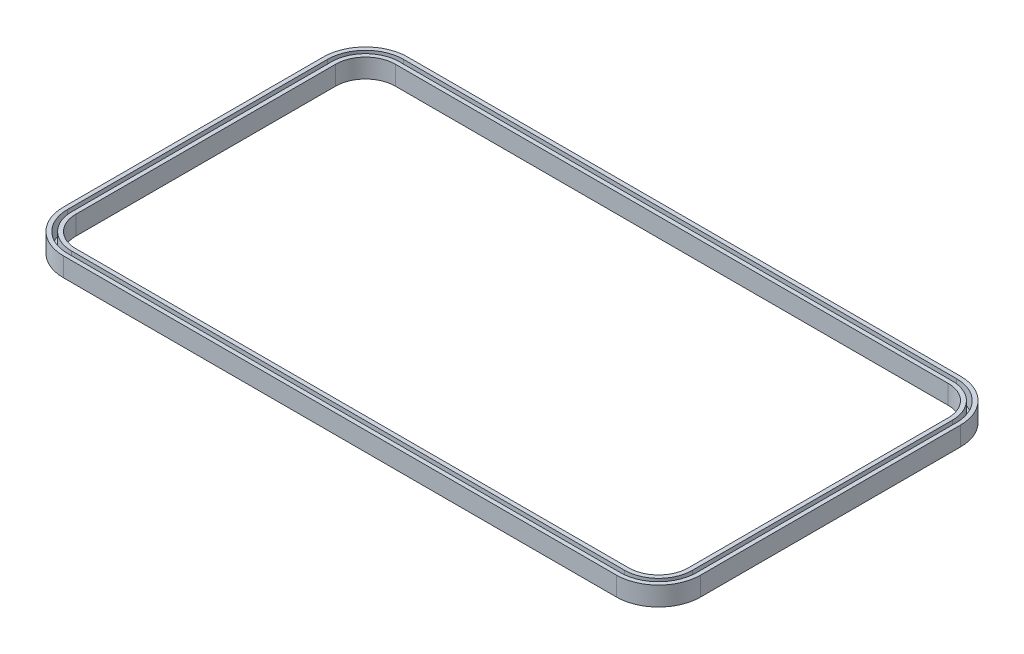
ISO-10303-21;
HEADER;
FILE_DESCRIPTION(('STEP AP214'),'2;1');
FILE_NAME('part.step','',(''),(''),'','','');
FILE_SCHEMA(('AUTOMOTIVE_DESIGN { 1 0 10303 214 1 1 1 1 }'));
ENDSEC;
DATA;
#1=APPLICATION_CONTEXT('core data for automotive mechanical design processes');
#2=APPLICATION_PROTOCOL_DEFINITION('international standard','automotive_design',2000,#1);
#3=PRODUCT_CONTEXT('',#1,'mechanical');
#4=PRODUCT('Part','Part','',(#3));
#5=PRODUCT_RELATED_PRODUCT_CATEGORY('part','',(#4));
#6=PRODUCT_DEFINITION_FORMATION('','',#4);
#7=PRODUCT_DEFINITION_CONTEXT('part definition',#1,'design');
#8=PRODUCT_DEFINITION('design','',#6,#7);
#9=PRODUCT_DEFINITION_SHAPE('','',#8);
#10=(LENGTH_UNIT() NAMED_UNIT(*) SI_UNIT(.MILLI.,.METRE.));
#11=(NAMED_UNIT(*) PLANE_ANGLE_UNIT() SI_UNIT($,.RADIAN.));
#12=(NAMED_UNIT(*) SI_UNIT($,.STERADIAN.) SOLID_ANGLE_UNIT());
#13=UNCERTAINTY_MEASURE_WITH_UNIT(LENGTH_MEASURE(1.E-05),#10,'distance_accuracy_value','');
#14=(GEOMETRIC_REPRESENTATION_CONTEXT(3) GLOBAL_UNCERTAINTY_ASSIGNED_CONTEXT((#13)) GLOBAL_UNIT_ASSIGNED_CONTEXT((#10,
#11,#12)) REPRESENTATION_CONTEXT('',''));
#15=CARTESIAN_POINT('',(0.,0.,0.));
#16=DIRECTION('',(0.,0.,1.));
#17=DIRECTION('',(1.,0.,0.));
#18=AXIS2_PLACEMENT_3D('',#15,#16,#17);
#19=CARTESIAN_POINT('',(167.,11.5,-78.5));
#20=DIRECTION('',(0.,-1.,0.));
#21=DIRECTION('',(0.,0.,-1.));
#22=AXIS2_PLACEMENT_3D('',#19,#20,#21);
#23=PLANE('',#22);
#24=DIRECTION('',(-1.,0.,0.));
#25=VECTOR('',#24,1.);
#26=CARTESIAN_POINT('',(-167.,11.5,-96.5));
#27=LINE('',#26,#25);
#28=CARTESIAN_POINT('',(167.,11.5,-96.5));
#29=VERTEX_POINT('',#28);
#30=CARTESIAN_POINT('',(-167.,11.5,-96.5));
#31=VERTEX_POINT('',#30);
#32=EDGE_CURVE('E481',#29,#31,#27,.T.);
#33=ORIENTED_EDGE('',*,*,#32,.F.);
#34=CARTESIAN_POINT('',(167.,11.5,-78.5));
#35=DIRECTION('',(0.,1.,0.));
#36=DIRECTION('',(0.,0.,1.));
#37=AXIS2_PLACEMENT_3D('',#34,#35,#36);
#38=CIRCLE('',#37,18.);
#39=CARTESIAN_POINT('',(185.,11.5,-78.4999999999999));
#40=VERTEX_POINT('',#39);
#41=EDGE_CURVE('E47',#40,#29,#38,.T.);
#42=ORIENTED_EDGE('',*,*,#41,.F.);
#43=DIRECTION('',(0.,0.,-1.));
#44=VECTOR('',#43,1.);
#45=CARTESIAN_POINT('',(185.,11.5,-78.4999999999999));
#46=LINE('',#45,#44);
#47=CARTESIAN_POINT('',(185.,11.5,78.4999999999999));
#48=VERTEX_POINT('',#47);
#49=EDGE_CURVE('E596',#48,#40,#46,.T.);
#50=ORIENTED_EDGE('',*,*,#49,.F.);
#51=CARTESIAN_POINT('',(167.,11.5,78.5));
#52=DIRECTION('',(0.,1.,0.));
#53=DIRECTION('',(0.,0.,1.));
#54=AXIS2_PLACEMENT_3D('',#51,#52,#53);
#55=CIRCLE('',#54,18.);
#56=CARTESIAN_POINT('',(167.,11.5,96.5));
#57=VERTEX_POINT('',#56);
#58=EDGE_CURVE('E594',#57,#48,#55,.T.);
#59=ORIENTED_EDGE('',*,*,#58,.F.);
#60=DIRECTION('',(1.,0.,0.));
#61=VECTOR('',#60,1.);
#62=CARTESIAN_POINT('',(-167.,11.5,96.5));
#63=LINE('',#62,#61);
#64=CARTESIAN_POINT('',(-167.,11.5,96.5));
#65=VERTEX_POINT('',#64);
#66=EDGE_CURVE('E591',#65,#57,#63,.T.);
#67=ORIENTED_EDGE('',*,*,#66,.F.);
#68=CARTESIAN_POINT('',(-167.,11.5,78.5));
#69=DIRECTION('',(0.,1.,0.));
#70=DIRECTION('',(0.,0.,1.));
#71=AXIS2_PLACEMENT_3D('',#68,#69,#70);
#72=CIRCLE('',#71,18.);
#73=CARTESIAN_POINT('',(-185.,11.5,78.4999999999999));
#74=VERTEX_POINT('',#73);
#75=EDGE_CURVE('E588',#74,#65,#72,.T.);
#76=ORIENTED_EDGE('',*,*,#75,.F.);
#77=DIRECTION('',(0.,0.,1.));
#78=VECTOR('',#77,1.);
#79=CARTESIAN_POINT('',(-185.,11.5,-78.4999999999999));
#80=LINE('',#79,#78);
#81=CARTESIAN_POINT('',(-185.,11.5,-78.5));
#82=VERTEX_POINT('',#81);
#83=EDGE_CURVE('E585',#82,#74,#80,.T.);
#84=ORIENTED_EDGE('',*,*,#83,.F.);
#85=CARTESIAN_POINT('',(-167.,11.5,-78.5));
#86=DIRECTION('',(0.,1.,0.));
#87=DIRECTION('',(0.,0.,1.));
#88=AXIS2_PLACEMENT_3D('',#85,#86,#87);
#89=CIRCLE('',#88,18.);
#90=EDGE_CURVE('E582',#31,#82,#89,.T.);
#91=ORIENTED_EDGE('',*,*,#90,.F.);
#92=EDGE_LOOP('',(#33,#42,#50,#59,#67,#76,#84,#91));
#93=FACE_BOUND('',#92,.T.);
#94=CARTESIAN_POINT('',(-167.,11.5,-78.5));
#95=DIRECTION('',(0.,1.,0.));
#96=DIRECTION('',(0.,0.,1.));
#97=AXIS2_PLACEMENT_3D('',#94,#95,#96);
#98=CIRCLE('',#97,20.5);
#99=CARTESIAN_POINT('',(-167.,11.5,-99.));
#100=VERTEX_POINT('',#99);
#101=CARTESIAN_POINT('',(-187.5,11.5,-78.4999999999999));
#102=VERTEX_POINT('',#101);
#103=EDGE_CURVE('E312',#100,#102,#98,.T.);
#104=ORIENTED_EDGE('',*,*,#103,.T.);
#105=DIRECTION('',(0.,0.,1.));
#106=VECTOR('',#105,1.);
#107=CARTESIAN_POINT('',(-187.5,11.5,-78.4999999999999));
#108=LINE('',#107,#106);
#109=CARTESIAN_POINT('',(-187.5,11.5,78.4999999999998));
#110=VERTEX_POINT('',#109);
#111=EDGE_CURVE('E261',#102,#110,#108,.T.);
#112=ORIENTED_EDGE('',*,*,#111,.T.);
#113=CARTESIAN_POINT('',(-167.,11.5,78.5));
#114=DIRECTION('',(0.,1.,0.));
#115=DIRECTION('',(0.,0.,1.));
#116=AXIS2_PLACEMENT_3D('',#113,#114,#115);
#117=CIRCLE('',#116,20.5);
#118=CARTESIAN_POINT('',(-167.,11.5,99.));
#119=VERTEX_POINT('',#118);
#120=EDGE_CURVE('E69',#110,#119,#117,.T.);
#121=ORIENTED_EDGE('',*,*,#120,.T.);
#122=DIRECTION('',(1.,0.,0.));
#123=VECTOR('',#122,1.);
#124=CARTESIAN_POINT('',(-167.,11.5,99.));
#125=LINE('',#124,#123);
#126=CARTESIAN_POINT('',(167.,11.5,99.));
#127=VERTEX_POINT('',#126);
#128=EDGE_CURVE('E319',#119,#127,#125,.T.);
#129=ORIENTED_EDGE('',*,*,#128,.T.);
#130=CARTESIAN_POINT('',(167.,11.5,78.5));
#131=DIRECTION('',(0.,1.,0.));
#132=DIRECTION('',(0.,0.,1.));
#133=AXIS2_PLACEMENT_3D('',#130,#131,#132);
#134=CIRCLE('',#133,20.5);
#135=CARTESIAN_POINT('',(187.5,11.5,78.4999999999998));
#136=VERTEX_POINT('',#135);
#137=EDGE_CURVE('E323',#127,#136,#134,.T.);
#138=ORIENTED_EDGE('',*,*,#137,.T.);
#139=DIRECTION('',(0.,0.,-1.));
#140=VECTOR('',#139,1.);
#141=CARTESIAN_POINT('',(187.5,11.5,-78.4999999999999));
#142=LINE('',#141,#140);
#143=CARTESIAN_POINT('',(187.5,11.5,-78.4999999999999));
#144=VERTEX_POINT('',#143);
#145=EDGE_CURVE('E327',#136,#144,#142,.T.);
#146=ORIENTED_EDGE('',*,*,#145,.T.);
#147=CARTESIAN_POINT('',(167.,11.5,-78.5));
#148=DIRECTION('',(0.,1.,0.));
#149=DIRECTION('',(0.,0.,-1.));
#150=AXIS2_PLACEMENT_3D('',#147,#148,#149);
#151=CIRCLE('',#150,20.5);
#152=CARTESIAN_POINT('',(167.,11.5,-99.));
#153=VERTEX_POINT('',#152);
#154=EDGE_CURVE('E289',#144,#153,#151,.T.);
#155=ORIENTED_EDGE('',*,*,#154,.T.);
#156=DIRECTION('',(-1.,0.,0.));
#157=VECTOR('',#156,1.);
#158=CARTESIAN_POINT('',(-167.,11.5,-99.));
#159=LINE('',#158,#157);
#160=EDGE_CURVE('E285',#153,#100,#159,.T.);
#161=ORIENTED_EDGE('',*,*,#160,.T.);
#162=EDGE_LOOP('',(#104,#112,#121,#129,#138,#146,#155,#161));
#163=FACE_BOUND('',#162,.T.);
#164=ADVANCED_FACE('F43',(#93,#163),#23,.F.);
#165=CARTESIAN_POINT('',(167.,11.5,-78.5));
#166=DIRECTION('',(0.,-1.,0.));
#167=DIRECTION('',(0.,0.,-1.));
#168=AXIS2_PLACEMENT_3D('',#165,#166,#167);
#169=CYLINDRICAL_SURFACE('',#168,25.5);
#170=CARTESIAN_POINT('',(167.,0.,-78.5));
#171=DIRECTION('',(0.,1.,0.));
#172=DIRECTION('',(0.,0.,-1.));
#173=AXIS2_PLACEMENT_3D('',#170,#171,#172);
#174=CIRCLE('',#173,25.5);
#175=CARTESIAN_POINT('',(192.5,0.,-78.4999999999998));
#176=VERTEX_POINT('',#175);
#177=CARTESIAN_POINT('',(167.,0.,-104.));
#178=VERTEX_POINT('',#177);
#179=EDGE_CURVE('E530',#176,#178,#174,.T.);
#180=ORIENTED_EDGE('',*,*,#179,.T.);
#181=DIRECTION('',(0.,-1.,0.));
#182=VECTOR('',#181,1.);
#183=CARTESIAN_POINT('',(167.,11.5,-104.));
#184=LINE('',#183,#182);
#185=CARTESIAN_POINT('',(167.,11.5,-104.));
#186=VERTEX_POINT('',#185);
#187=EDGE_CURVE('E11',#186,#178,#184,.T.);
#188=ORIENTED_EDGE('',*,*,#187,.F.);
#189=CARTESIAN_POINT('',(167.,11.5,-78.5));
#190=DIRECTION('',(0.,1.,0.));
#191=DIRECTION('',(0.,0.,-1.));
#192=AXIS2_PLACEMENT_3D('',#189,#190,#191);
#193=CIRCLE('',#192,25.5);
#194=CARTESIAN_POINT('',(192.5,11.5,-78.4999999999998));
#195=VERTEX_POINT('',#194);
#196=EDGE_CURVE('E503',#195,#186,#193,.T.);
#197=ORIENTED_EDGE('',*,*,#196,.F.);
#198=DIRECTION('',(0.,-1.,0.));
#199=VECTOR('',#198,1.);
#200=CARTESIAN_POINT('',(192.5,11.5,-78.4999999999998));
#201=LINE('',#200,#199);
#202=EDGE_CURVE('E529',#195,#176,#201,.T.);
#203=ORIENTED_EDGE('',*,*,#202,.T.);
#204=EDGE_LOOP('',(#180,#188,#197,#203));
#205=FACE_BOUND('',#204,.T.);
#206=ADVANCED_FACE('F45',(#205),#169,.T.);
#207=CARTESIAN_POINT('',(-167.,11.5,-104.));
#208=DIRECTION('',(0.,0.,1.));
#209=DIRECTION('',(1.,0.,0.));
#210=AXIS2_PLACEMENT_3D('',#207,#208,#209);
#211=PLANE('',#210);
#212=DIRECTION('',(-1.,0.,0.));
#213=VECTOR('',#212,1.);
#214=CARTESIAN_POINT('',(-167.,0.,-104.));
#215=LINE('',#214,#213);
#216=CARTESIAN_POINT('',(-167.,0.,-104.));
#217=VERTEX_POINT('',#216);
#218=EDGE_CURVE('E534',#178,#217,#215,.T.);
#219=ORIENTED_EDGE('',*,*,#218,.T.);
#220=DIRECTION('',(0.,-1.,0.));
#221=VECTOR('',#220,1.);
#222=CARTESIAN_POINT('',(-167.,11.5,-104.));
#223=LINE('',#222,#221);
#224=CARTESIAN_POINT('',(-167.,11.5,-104.));
#225=VERTEX_POINT('',#224);
#226=EDGE_CURVE('E53',#225,#217,#223,.T.);
#227=ORIENTED_EDGE('',*,*,#226,.F.);
#228=DIRECTION('',(-1.,0.,0.));
#229=VECTOR('',#228,1.);
#230=CARTESIAN_POINT('',(-167.,11.5,-104.));
#231=LINE('',#230,#229);
#232=EDGE_CURVE('E507',#186,#225,#231,.T.);
#233=ORIENTED_EDGE('',*,*,#232,.F.);
#234=ORIENTED_EDGE('',*,*,#187,.T.);
#235=EDGE_LOOP('',(#219,#227,#233,#234));
#236=FACE_BOUND('',#235,.T.);
#237=ADVANCED_FACE('F651',(#236),#211,.F.);
#238=CARTESIAN_POINT('',(-167.,11.5,-78.5));
#239=DIRECTION('',(0.,-1.,0.));
#240=DIRECTION('',(0.,0.,-1.));
#241=AXIS2_PLACEMENT_3D('',#238,#239,#240);
#242=CYLINDRICAL_SURFACE('',#241,25.5);
#243=CARTESIAN_POINT('',(-167.,0.,-78.5));
#244=DIRECTION('',(0.,1.,0.));
#245=DIRECTION('',(0.,0.,1.));
#246=AXIS2_PLACEMENT_3D('',#243,#244,#245);
#247=CIRCLE('',#246,25.5);
#248=CARTESIAN_POINT('',(-192.5,0.,-78.4999999999998));
#249=VERTEX_POINT('',#248);
#250=EDGE_CURVE('E537',#217,#249,#247,.T.);
#251=ORIENTED_EDGE('',*,*,#250,.T.);
#252=DIRECTION('',(0.,-1.,0.));
#253=VECTOR('',#252,1.);
#254=CARTESIAN_POINT('',(-192.5,11.5,-78.4999999999998));
#255=LINE('',#254,#253);
#256=CARTESIAN_POINT('',(-192.5,11.5,-78.4999999999998));
#257=VERTEX_POINT('',#256);
#258=EDGE_CURVE('E573',#257,#249,#255,.T.);
#259=ORIENTED_EDGE('',*,*,#258,.F.);
#260=CARTESIAN_POINT('',(-167.,11.5,-78.5));
#261=DIRECTION('',(0.,1.,0.));
#262=DIRECTION('',(0.,0.,1.));
#263=AXIS2_PLACEMENT_3D('',#260,#261,#262);
#264=CIRCLE('',#263,25.5);
#265=EDGE_CURVE('E511',#225,#257,#264,.T.);
#266=ORIENTED_EDGE('',*,*,#265,.F.);
#267=ORIENTED_EDGE('',*,*,#226,.T.);
#268=EDGE_LOOP('',(#251,#259,#266,#267));
#269=FACE_BOUND('',#268,.T.);
#270=ADVANCED_FACE('F679',(#269),#242,.T.);
#271=CARTESIAN_POINT('',(-192.5,11.5,-78.4999999999998));
#272=DIRECTION('',(1.,0.,0.));
#273=DIRECTION('',(0.,0.,-1.));
#274=AXIS2_PLACEMENT_3D('',#271,#272,#273);
#275=PLANE('',#274);
#276=DIRECTION('',(0.,0.,1.));
#277=VECTOR('',#276,1.);
#278=CARTESIAN_POINT('',(-192.5,0.,-78.4999999999998));
#279=LINE('',#278,#277);
#280=CARTESIAN_POINT('',(-192.5,0.,78.4999999999998));
#281=VERTEX_POINT('',#280);
#282=EDGE_CURVE('E540',#249,#281,#279,.T.);
#283=ORIENTED_EDGE('',*,*,#282,.T.);
#284=DIRECTION('',(0.,-1.,0.));
#285=VECTOR('',#284,1.);
#286=CARTESIAN_POINT('',(-192.5,11.5,78.4999999999998));
#287=LINE('',#286,#285);
#288=CARTESIAN_POINT('',(-192.5,11.5,78.4999999999998));
#289=VERTEX_POINT('',#288);
#290=EDGE_CURVE('E569',#289,#281,#287,.T.);
#291=ORIENTED_EDGE('',*,*,#290,.F.);
#292=DIRECTION('',(0.,0.,1.));
#293=VECTOR('',#292,1.);
#294=CARTESIAN_POINT('',(-192.5,11.5,-78.4999999999998));
#295=LINE('',#294,#293);
#296=EDGE_CURVE('E514',#257,#289,#295,.T.);
#297=ORIENTED_EDGE('',*,*,#296,.F.);
#298=ORIENTED_EDGE('',*,*,#258,.T.);
#299=EDGE_LOOP('',(#283,#291,#297,#298));
#300=FACE_BOUND('',#299,.T.);
#301=ADVANCED_FACE('F685',(#300),#275,.F.);
#302=CARTESIAN_POINT('',(-167.,11.5,78.5));
#303=DIRECTION('',(0.,-1.,0.));
#304=DIRECTION('',(0.,0.,-1.));
#305=AXIS2_PLACEMENT_3D('',#302,#303,#304);
#306=CYLINDRICAL_SURFACE('',#305,25.5);
#307=CARTESIAN_POINT('',(-167.,0.,78.5));
#308=DIRECTION('',(0.,1.,0.));
#309=DIRECTION('',(0.,0.,1.));
#310=AXIS2_PLACEMENT_3D('',#307,#308,#309);
#311=CIRCLE('',#310,25.5);
#312=CARTESIAN_POINT('',(-167.,0.,104.));
#313=VERTEX_POINT('',#312);
#314=EDGE_CURVE('E543',#281,#313,#311,.T.);
#315=ORIENTED_EDGE('',*,*,#314,.T.);
#316=DIRECTION('',(0.,-1.,0.));
#317=VECTOR('',#316,1.);
#318=CARTESIAN_POINT('',(-167.,11.5,104.));
#319=LINE('',#318,#317);
#320=CARTESIAN_POINT('',(-167.,11.5,104.));
#321=VERTEX_POINT('',#320);
#322=EDGE_CURVE('E565',#321,#313,#319,.T.);
#323=ORIENTED_EDGE('',*,*,#322,.F.);
#324=CARTESIAN_POINT('',(-167.,11.5,78.5));
#325=DIRECTION('',(0.,1.,0.));
#326=DIRECTION('',(0.,0.,1.));
#327=AXIS2_PLACEMENT_3D('',#324,#325,#326);
#328=CIRCLE('',#327,25.5);
#329=EDGE_CURVE('E517',#289,#321,#328,.T.);
#330=ORIENTED_EDGE('',*,*,#329,.F.);
#331=ORIENTED_EDGE('',*,*,#290,.T.);
#332=EDGE_LOOP('',(#315,#323,#330,#331));
#333=FACE_BOUND('',#332,.T.);
#334=ADVANCED_FACE('F689',(#333),#306,.T.);
#335=CARTESIAN_POINT('',(-167.,11.5,104.));
#336=DIRECTION('',(0.,0.,-1.));
#337=DIRECTION('',(-1.,0.,0.));
#338=AXIS2_PLACEMENT_3D('',#335,#336,#337);
#339=PLANE('',#338);
#340=DIRECTION('',(1.,0.,0.));
#341=VECTOR('',#340,1.);
#342=CARTESIAN_POINT('',(-167.,0.,104.));
#343=LINE('',#342,#341);
#344=CARTESIAN_POINT('',(167.,0.,104.));
#345=VERTEX_POINT('',#344);
#346=EDGE_CURVE('E546',#313,#345,#343,.T.);
#347=ORIENTED_EDGE('',*,*,#346,.T.);
#348=DIRECTION('',(0.,-1.,0.));
#349=VECTOR('',#348,1.);
#350=CARTESIAN_POINT('',(167.,11.5,104.));
#351=LINE('',#350,#349);
#352=CARTESIAN_POINT('',(167.,11.5,104.));
#353=VERTEX_POINT('',#352);
#354=EDGE_CURVE('E561',#353,#345,#351,.T.);
#355=ORIENTED_EDGE('',*,*,#354,.F.);
#356=DIRECTION('',(1.,0.,0.));
#357=VECTOR('',#356,1.);
#358=CARTESIAN_POINT('',(-167.,11.5,104.));
#359=LINE('',#358,#357);
#360=EDGE_CURVE('E520',#321,#353,#359,.T.);
#361=ORIENTED_EDGE('',*,*,#360,.F.);
#362=ORIENTED_EDGE('',*,*,#322,.T.);
#363=EDGE_LOOP('',(#347,#355,#361,#362));
#364=FACE_BOUND('',#363,.T.);
#365=ADVANCED_FACE('F694',(#364),#339,.F.);
#366=CARTESIAN_POINT('',(167.,11.5,78.5));
#367=DIRECTION('',(0.,-1.,0.));
#368=DIRECTION('',(0.,0.,-1.));
#369=AXIS2_PLACEMENT_3D('',#366,#367,#368);
#370=CYLINDRICAL_SURFACE('',#369,25.5);
#371=CARTESIAN_POINT('',(167.,0.,78.5));
#372=DIRECTION('',(0.,1.,0.));
#373=DIRECTION('',(0.,0.,1.));
#374=AXIS2_PLACEMENT_3D('',#371,#372,#373);
#375=CIRCLE('',#374,25.5);
#376=CARTESIAN_POINT('',(192.5,0.,78.4999999999998));
#377=VERTEX_POINT('',#376);
#378=EDGE_CURVE('E549',#345,#377,#375,.T.);
#379=ORIENTED_EDGE('',*,*,#378,.T.);
#380=DIRECTION('',(0.,-1.,0.));
#381=VECTOR('',#380,1.);
#382=CARTESIAN_POINT('',(192.5,11.5,78.4999999999998));
#383=LINE('',#382,#381);
#384=CARTESIAN_POINT('',(192.5,11.5,78.4999999999998));
#385=VERTEX_POINT('',#384);
#386=EDGE_CURVE('E557',#385,#377,#383,.T.);
#387=ORIENTED_EDGE('',*,*,#386,.F.);
#388=CARTESIAN_POINT('',(167.,11.5,78.5));
#389=DIRECTION('',(0.,1.,0.));
#390=DIRECTION('',(0.,0.,1.));
#391=AXIS2_PLACEMENT_3D('',#388,#389,#390);
#392=CIRCLE('',#391,25.5);
#393=EDGE_CURVE('E523',#353,#385,#392,.T.);
#394=ORIENTED_EDGE('',*,*,#393,.F.);
#395=ORIENTED_EDGE('',*,*,#354,.T.);
#396=EDGE_LOOP('',(#379,#387,#394,#395));
#397=FACE_BOUND('',#396,.T.);
#398=ADVANCED_FACE('F662',(#397),#370,.T.);
#399=CARTESIAN_POINT('',(192.5,11.5,-78.4999999999998));
#400=DIRECTION('',(-1.,0.,0.));
#401=DIRECTION('',(0.,0.,1.));
#402=AXIS2_PLACEMENT_3D('',#399,#400,#401);
#403=PLANE('',#402);
#404=DIRECTION('',(0.,0.,-1.));
#405=VECTOR('',#404,1.);
#406=CARTESIAN_POINT('',(192.5,0.,-78.4999999999998));
#407=LINE('',#406,#405);
#408=EDGE_CURVE('E508',#377,#176,#407,.T.);
#409=ORIENTED_EDGE('',*,*,#408,.T.);
#410=ORIENTED_EDGE('',*,*,#202,.F.);
#411=DIRECTION('',(0.,0.,-1.));
#412=VECTOR('',#411,1.);
#413=CARTESIAN_POINT('',(192.5,11.5,-78.4999999999998));
#414=LINE('',#413,#412);
#415=EDGE_CURVE('E526',#385,#195,#414,.T.);
#416=ORIENTED_EDGE('',*,*,#415,.F.);
#417=ORIENTED_EDGE('',*,*,#386,.T.);
#418=EDGE_LOOP('',(#409,#410,#416,#417));
#419=FACE_BOUND('',#418,.T.);
#420=ADVANCED_FACE('F656',(#419),#403,.F.);
#421=DIRECTION('',(0.,0.,-1.));
#422=VECTOR('',#421,1.);
#423=CARTESIAN_POINT('',(190.,11.5,-78.4999999999998));
#424=LINE('',#423,#422);
#425=CARTESIAN_POINT('',(190.,11.5,78.4999999999998));
#426=VERTEX_POINT('',#425);
#427=CARTESIAN_POINT('',(190.,11.5,-78.4999999999998));
#428=VERTEX_POINT('',#427);
#429=EDGE_CURVE('E389',#426,#428,#424,.T.);
#430=ORIENTED_EDGE('',*,*,#429,.F.);
#431=CARTESIAN_POINT('',(167.,11.5,78.5));
#432=DIRECTION('',(0.,1.,0.));
#433=DIRECTION('',(0.,0.,1.));
#434=AXIS2_PLACEMENT_3D('',#431,#432,#433);
#435=CIRCLE('',#434,23.);
#436=CARTESIAN_POINT('',(167.,11.5,101.5));
#437=VERTEX_POINT('',#436);
#438=EDGE_CURVE('E61',#437,#426,#435,.T.);
#439=ORIENTED_EDGE('',*,*,#438,.F.);
#440=DIRECTION('',(1.,0.,0.));
#441=VECTOR('',#440,1.);
#442=CARTESIAN_POINT('',(-167.,11.5,101.5));
#443=LINE('',#442,#441);
#444=CARTESIAN_POINT('',(-167.,11.5,101.5));
#445=VERTEX_POINT('',#444);
#446=EDGE_CURVE('E358',#445,#437,#443,.T.);
#447=ORIENTED_EDGE('',*,*,#446,.F.);
#448=CARTESIAN_POINT('',(-167.,11.5,78.5));
#449=DIRECTION('',(0.,1.,0.));
#450=DIRECTION('',(0.,0.,1.));
#451=AXIS2_PLACEMENT_3D('',#448,#449,#450);
#452=CIRCLE('',#451,23.);
#453=CARTESIAN_POINT('',(-190.,11.5,78.4999999999998));
#454=VERTEX_POINT('',#453);
#455=EDGE_CURVE('E409',#454,#445,#452,.T.);
#456=ORIENTED_EDGE('',*,*,#455,.F.);
#457=DIRECTION('',(0.,0.,1.));
#458=VECTOR('',#457,1.);
#459=CARTESIAN_POINT('',(-190.,11.5,-78.4999999999998));
#460=LINE('',#459,#458);
#461=CARTESIAN_POINT('',(-190.,11.5,-78.4999999999998));
#462=VERTEX_POINT('',#461);
#463=EDGE_CURVE('E405',#462,#454,#460,.T.);
#464=ORIENTED_EDGE('',*,*,#463,.F.);
#465=CARTESIAN_POINT('',(-167.,11.5,-78.5));
#466=DIRECTION('',(0.,1.,0.));
#467=DIRECTION('',(0.,0.,1.));
#468=AXIS2_PLACEMENT_3D('',#465,#466,#467);
#469=CIRCLE('',#468,23.);
#470=CARTESIAN_POINT('',(-167.,11.5,-101.5));
#471=VERTEX_POINT('',#470);
#472=EDGE_CURVE('E401',#471,#462,#469,.T.);
#473=ORIENTED_EDGE('',*,*,#472,.F.);
#474=DIRECTION('',(-1.,0.,0.));
#475=VECTOR('',#474,1.);
#476=CARTESIAN_POINT('',(-167.,11.5,-101.5));
#477=LINE('',#476,#475);
#478=CARTESIAN_POINT('',(167.,11.5,-101.5));
#479=VERTEX_POINT('',#478);
#480=EDGE_CURVE('E397',#479,#471,#477,.T.);
#481=ORIENTED_EDGE('',*,*,#480,.F.);
#482=CARTESIAN_POINT('',(167.,11.5,-78.5));
#483=DIRECTION('',(0.,1.,0.));
#484=DIRECTION('',(0.,0.,-1.));
#485=AXIS2_PLACEMENT_3D('',#482,#483,#484);
#486=CIRCLE('',#485,23.);
#487=EDGE_CURVE('E393',#428,#479,#486,.T.);
#488=ORIENTED_EDGE('',*,*,#487,.F.);
#489=EDGE_LOOP('',(#430,#439,#447,#456,#464,#473,#481,#488));
#490=FACE_BOUND('',#489,.T.);
#491=ORIENTED_EDGE('',*,*,#196,.T.);
#492=ORIENTED_EDGE('',*,*,#232,.T.);
#493=ORIENTED_EDGE('',*,*,#265,.T.);
#494=ORIENTED_EDGE('',*,*,#296,.T.);
#495=ORIENTED_EDGE('',*,*,#329,.T.);
#496=ORIENTED_EDGE('',*,*,#360,.T.);
#497=ORIENTED_EDGE('',*,*,#393,.T.);
#498=ORIENTED_EDGE('',*,*,#415,.T.);
#499=EDGE_LOOP('',(#491,#492,#493,#494,#495,#496,#497,#498));
#500=FACE_BOUND('',#499,.T.);
#501=ADVANCED_FACE('F647',(#490,#500),#23,.F.);
#502=CARTESIAN_POINT('',(167.,0.,-78.5));
#503=DIRECTION('',(0.,-1.,0.));
#504=DIRECTION('',(0.,0.,-1.));
#505=AXIS2_PLACEMENT_3D('',#502,#503,#504);
#506=PLANE('',#505);
#507=CARTESIAN_POINT('',(167.,0.,-78.5));
#508=DIRECTION('',(0.,1.,0.));
#509=DIRECTION('',(0.,0.,-1.));
#510=AXIS2_PLACEMENT_3D('',#507,#508,#509);
#511=CIRCLE('',#510,18.);
#512=CARTESIAN_POINT('',(185.,0.,-78.4999999999999));
#513=VERTEX_POINT('',#512);
#514=CARTESIAN_POINT('',(167.,0.,-96.5));
#515=VERTEX_POINT('',#514);
#516=EDGE_CURVE('E419',#513,#515,#511,.T.);
#517=ORIENTED_EDGE('',*,*,#516,.T.);
#518=DIRECTION('',(-1.,0.,0.));
#519=VECTOR('',#518,1.);
#520=CARTESIAN_POINT('',(-167.,0.,-96.5));
#521=LINE('',#520,#519);
#522=CARTESIAN_POINT('',(-167.,0.,-96.5));
#523=VERTEX_POINT('',#522);
#524=EDGE_CURVE('E443',#515,#523,#521,.T.);
#525=ORIENTED_EDGE('',*,*,#524,.T.);
#526=CARTESIAN_POINT('',(-167.,0.,-78.5));
#527=DIRECTION('',(0.,1.,0.));
#528=DIRECTION('',(0.,0.,1.));
#529=AXIS2_PLACEMENT_3D('',#526,#527,#528);
#530=CIRCLE('',#529,18.);
#531=CARTESIAN_POINT('',(-185.,0.,-78.4999999999999));
#532=VERTEX_POINT('',#531);
#533=EDGE_CURVE('E447',#523,#532,#530,.T.);
#534=ORIENTED_EDGE('',*,*,#533,.T.);
#535=DIRECTION('',(0.,0.,1.));
#536=VECTOR('',#535,1.);
#537=CARTESIAN_POINT('',(-185.,0.,-78.4999999999999));
#538=LINE('',#537,#536);
#539=CARTESIAN_POINT('',(-185.,0.,78.4999999999998));
#540=VERTEX_POINT('',#539);
#541=EDGE_CURVE('E451',#532,#540,#538,.T.);
#542=ORIENTED_EDGE('',*,*,#541,.T.);
#543=CARTESIAN_POINT('',(-167.,0.,78.5));
#544=DIRECTION('',(0.,1.,0.));
#545=DIRECTION('',(0.,0.,1.));
#546=AXIS2_PLACEMENT_3D('',#543,#544,#545);
#547=CIRCLE('',#546,18.);
#548=CARTESIAN_POINT('',(-167.,0.,96.5));
#549=VERTEX_POINT('',#548);
#550=EDGE_CURVE('E455',#540,#549,#547,.T.);
#551=ORIENTED_EDGE('',*,*,#550,.T.);
#552=DIRECTION('',(1.,0.,0.));
#553=VECTOR('',#552,1.);
#554=CARTESIAN_POINT('',(-167.,0.,96.5));
#555=LINE('',#554,#553);
#556=CARTESIAN_POINT('',(167.,0.,96.5));
#557=VERTEX_POINT('',#556);
#558=EDGE_CURVE('E459',#549,#557,#555,.T.);
#559=ORIENTED_EDGE('',*,*,#558,.T.);
#560=CARTESIAN_POINT('',(167.,0.,78.5));
#561=DIRECTION('',(0.,1.,0.));
#562=DIRECTION('',(0.,0.,1.));
#563=AXIS2_PLACEMENT_3D('',#560,#561,#562);
#564=CIRCLE('',#563,18.);
#565=CARTESIAN_POINT('',(185.,0.,78.4999999999998));
#566=VERTEX_POINT('',#565);
#567=EDGE_CURVE('E463',#557,#566,#564,.T.);
#568=ORIENTED_EDGE('',*,*,#567,.T.);
#569=DIRECTION('',(0.,0.,-1.));
#570=VECTOR('',#569,1.);
#571=CARTESIAN_POINT('',(185.,0.,-78.4999999999999));
#572=LINE('',#571,#570);
#573=EDGE_CURVE('E467',#566,#513,#572,.T.);
#574=ORIENTED_EDGE('',*,*,#573,.T.);
#575=EDGE_LOOP('',(#517,#525,#534,#542,#551,#559,#568,#574));
#576=FACE_BOUND('',#575,.T.);
#577=ORIENTED_EDGE('',*,*,#179,.F.);
#578=ORIENTED_EDGE('',*,*,#408,.F.);
#579=ORIENTED_EDGE('',*,*,#378,.F.);
#580=ORIENTED_EDGE('',*,*,#346,.F.);
#581=ORIENTED_EDGE('',*,*,#314,.F.);
#582=ORIENTED_EDGE('',*,*,#282,.F.);
#583=ORIENTED_EDGE('',*,*,#250,.F.);
#584=ORIENTED_EDGE('',*,*,#218,.F.);
#585=EDGE_LOOP('',(#577,#578,#579,#580,#581,#582,#583,#584));
#586=FACE_BOUND('',#585,.T.);
#587=ADVANCED_FACE('F619',(#576,#586),#506,.T.);
#588=CARTESIAN_POINT('',(167.,0.,-78.5));
#589=DIRECTION('',(0.,1.,0.));
#590=DIRECTION('',(0.,0.,1.));
#591=AXIS2_PLACEMENT_3D('',#588,#589,#590);
#592=CYLINDRICAL_SURFACE('',#591,18.);
#593=DIRECTION('',(0.,1.,0.));
#594=VECTOR('',#593,1.);
#595=CARTESIAN_POINT('',(167.,0.,-96.5));
#596=LINE('',#595,#594);
#597=EDGE_CURVE('E471',#515,#29,#596,.T.);
#598=ORIENTED_EDGE('',*,*,#597,.F.);
#599=ORIENTED_EDGE('',*,*,#516,.F.);
#600=DIRECTION('',(0.,1.,0.));
#601=VECTOR('',#600,1.);
#602=CARTESIAN_POINT('',(185.,0.,-78.4999999999999));
#603=LINE('',#602,#601);
#604=EDGE_CURVE('E476',#513,#40,#603,.T.);
#605=ORIENTED_EDGE('',*,*,#604,.T.);
#606=ORIENTED_EDGE('',*,*,#41,.T.);
#607=EDGE_LOOP('',(#598,#599,#605,#606));
#608=FACE_BOUND('',#607,.T.);
#609=ADVANCED_FACE('F605',(#608),#592,.F.);
#610=CARTESIAN_POINT('',(185.,0.,-78.4999999999999));
#611=DIRECTION('',(1.,0.,0.));
#612=DIRECTION('',(0.,0.,-1.));
#613=AXIS2_PLACEMENT_3D('',#610,#611,#612);
#614=PLANE('',#613);
#615=ORIENTED_EDGE('',*,*,#604,.F.);
#616=ORIENTED_EDGE('',*,*,#573,.F.);
#617=DIRECTION('',(0.,1.,0.));
#618=VECTOR('',#617,1.);
#619=CARTESIAN_POINT('',(185.,0.,78.4999999999998));
#620=LINE('',#619,#618);
#621=EDGE_CURVE('E472',#566,#48,#620,.T.);
#622=ORIENTED_EDGE('',*,*,#621,.T.);
#623=ORIENTED_EDGE('',*,*,#49,.T.);
#624=EDGE_LOOP('',(#615,#616,#622,#623));
#625=FACE_BOUND('',#624,.T.);
#626=ADVANCED_FACE('F623',(#625),#614,.F.);
#627=CARTESIAN_POINT('',(167.,0.,78.5));
#628=DIRECTION('',(0.,1.,0.));
#629=DIRECTION('',(0.,0.,1.));
#630=AXIS2_PLACEMENT_3D('',#627,#628,#629);
#631=CYLINDRICAL_SURFACE('',#630,18.);
#632=ORIENTED_EDGE('',*,*,#621,.F.);
#633=ORIENTED_EDGE('',*,*,#567,.F.);
#634=DIRECTION('',(0.,1.,0.));
#635=VECTOR('',#634,1.);
#636=CARTESIAN_POINT('',(167.,0.,96.5));
#637=LINE('',#636,#635);
#638=EDGE_CURVE('E477',#557,#57,#637,.T.);
#639=ORIENTED_EDGE('',*,*,#638,.T.);
#640=ORIENTED_EDGE('',*,*,#58,.T.);
#641=EDGE_LOOP('',(#632,#633,#639,#640));
#642=FACE_BOUND('',#641,.T.);
#643=ADVANCED_FACE('F628',(#642),#631,.F.);
#644=CARTESIAN_POINT('',(-167.,0.,96.5));
#645=DIRECTION('',(0.,0.,1.));
#646=DIRECTION('',(1.,0.,0.));
#647=AXIS2_PLACEMENT_3D('',#644,#645,#646);
#648=PLANE('',#647);
#649=ORIENTED_EDGE('',*,*,#638,.F.);
#650=ORIENTED_EDGE('',*,*,#558,.F.);
#651=DIRECTION('',(0.,1.,0.));
#652=VECTOR('',#651,1.);
#653=CARTESIAN_POINT('',(-167.,0.,96.5));
#654=LINE('',#653,#652);
#655=EDGE_CURVE('E488',#549,#65,#654,.T.);
#656=ORIENTED_EDGE('',*,*,#655,.T.);
#657=ORIENTED_EDGE('',*,*,#66,.T.);
#658=EDGE_LOOP('',(#649,#650,#656,#657));
#659=FACE_BOUND('',#658,.T.);
#660=ADVANCED_FACE('F631',(#659),#648,.F.);
#661=CARTESIAN_POINT('',(-167.,0.,78.5));
#662=DIRECTION('',(0.,1.,0.));
#663=DIRECTION('',(0.,0.,1.));
#664=AXIS2_PLACEMENT_3D('',#661,#662,#663);
#665=CYLINDRICAL_SURFACE('',#664,18.);
#666=ORIENTED_EDGE('',*,*,#655,.F.);
#667=ORIENTED_EDGE('',*,*,#550,.F.);
#668=DIRECTION('',(0.,1.,0.));
#669=VECTOR('',#668,1.);
#670=CARTESIAN_POINT('',(-185.,0.,78.4999999999998));
#671=LINE('',#670,#669);
#672=EDGE_CURVE('E492',#540,#74,#671,.T.);
#673=ORIENTED_EDGE('',*,*,#672,.T.);
#674=ORIENTED_EDGE('',*,*,#75,.T.);
#675=EDGE_LOOP('',(#666,#667,#673,#674));
#676=FACE_BOUND('',#675,.T.);
#677=ADVANCED_FACE('F634',(#676),#665,.F.);
#678=CARTESIAN_POINT('',(-185.,0.,-78.4999999999999));
#679=DIRECTION('',(-1.,0.,0.));
#680=DIRECTION('',(0.,0.,1.));
#681=AXIS2_PLACEMENT_3D('',#678,#679,#680);
#682=PLANE('',#681);
#683=ORIENTED_EDGE('',*,*,#672,.F.);
#684=ORIENTED_EDGE('',*,*,#541,.F.);
#685=DIRECTION('',(0.,1.,0.));
#686=VECTOR('',#685,1.);
#687=CARTESIAN_POINT('',(-185.,0.,-78.4999999999999));
#688=LINE('',#687,#686);
#689=EDGE_CURVE('E496',#532,#82,#688,.T.);
#690=ORIENTED_EDGE('',*,*,#689,.T.);
#691=ORIENTED_EDGE('',*,*,#83,.T.);
#692=EDGE_LOOP('',(#683,#684,#690,#691));
#693=FACE_BOUND('',#692,.T.);
#694=ADVANCED_FACE('F636',(#693),#682,.F.);
#695=CARTESIAN_POINT('',(-167.,0.,-78.5));
#696=DIRECTION('',(0.,1.,0.));
#697=DIRECTION('',(0.,0.,1.));
#698=AXIS2_PLACEMENT_3D('',#695,#696,#697);
#699=CYLINDRICAL_SURFACE('',#698,18.);
#700=ORIENTED_EDGE('',*,*,#689,.F.);
#701=ORIENTED_EDGE('',*,*,#533,.F.);
#702=DIRECTION('',(0.,1.,0.));
#703=VECTOR('',#702,1.);
#704=CARTESIAN_POINT('',(-167.,0.,-96.5));
#705=LINE('',#704,#703);
#706=EDGE_CURVE('E484',#523,#31,#705,.T.);
#707=ORIENTED_EDGE('',*,*,#706,.T.);
#708=ORIENTED_EDGE('',*,*,#90,.T.);
#709=EDGE_LOOP('',(#700,#701,#707,#708));
#710=FACE_BOUND('',#709,.T.);
#711=ADVANCED_FACE('F616',(#710),#699,.F.);
#712=CARTESIAN_POINT('',(-167.,0.,-96.5));
#713=DIRECTION('',(0.,0.,-1.));
#714=DIRECTION('',(-1.,0.,0.));
#715=AXIS2_PLACEMENT_3D('',#712,#713,#714);
#716=PLANE('',#715);
#717=ORIENTED_EDGE('',*,*,#706,.F.);
#718=ORIENTED_EDGE('',*,*,#524,.F.);
#719=ORIENTED_EDGE('',*,*,#597,.T.);
#720=ORIENTED_EDGE('',*,*,#32,.T.);
#721=EDGE_LOOP('',(#717,#718,#719,#720));
#722=FACE_BOUND('',#721,.T.);
#723=ADVANCED_FACE('F614',(#722),#716,.F.);
#724=CARTESIAN_POINT('',(167.,1.5,78.5));
#725=DIRECTION('',(0.,1.,0.));
#726=DIRECTION('',(0.,0.,1.));
#727=AXIS2_PLACEMENT_3D('',#724,#725,#726);
#728=CYLINDRICAL_SURFACE('',#727,23.);
#729=ORIENTED_EDGE('',*,*,#438,.T.);
#730=DIRECTION('',(0.,1.,0.));
#731=VECTOR('',#730,1.);
#732=CARTESIAN_POINT('',(190.,1.5,78.4999999999998));
#733=LINE('',#732,#731);
#734=CARTESIAN_POINT('',(190.,1.5,78.4999999999998));
#735=VERTEX_POINT('',#734);
#736=EDGE_CURVE('E386',#735,#426,#733,.T.);
#737=ORIENTED_EDGE('',*,*,#736,.F.);
#738=CARTESIAN_POINT('',(167.,1.5,78.5));
#739=DIRECTION('',(0.,1.,0.));
#740=DIRECTION('',(0.,0.,1.));
#741=AXIS2_PLACEMENT_3D('',#738,#739,#740);
#742=CIRCLE('',#741,23.);
#743=CARTESIAN_POINT('',(167.,1.5,101.5));
#744=VERTEX_POINT('',#743);
#745=EDGE_CURVE('E353',#744,#735,#742,.T.);
#746=ORIENTED_EDGE('',*,*,#745,.F.);
#747=DIRECTION('',(0.,1.,0.));
#748=VECTOR('',#747,1.);
#749=CARTESIAN_POINT('',(167.,1.5,101.5));
#750=LINE('',#749,#748);
#751=EDGE_CURVE('E416',#744,#437,#750,.T.);
#752=ORIENTED_EDGE('',*,*,#751,.T.);
#753=EDGE_LOOP('',(#729,#737,#746,#752));
#754=FACE_BOUND('',#753,.T.);
#755=ADVANCED_FACE('F816',(#754),#728,.F.);
#756=CARTESIAN_POINT('',(-167.,1.5,101.5));
#757=DIRECTION('',(0.,0.,1.));
#758=DIRECTION('',(1.,0.,0.));
#759=AXIS2_PLACEMENT_3D('',#756,#757,#758);
#760=PLANE('',#759);
#761=ORIENTED_EDGE('',*,*,#446,.T.);
#762=ORIENTED_EDGE('',*,*,#751,.F.);
#763=DIRECTION('',(1.,0.,0.));
#764=VECTOR('',#763,1.);
#765=CARTESIAN_POINT('',(-167.,1.5,101.5));
#766=LINE('',#765,#764);
#767=CARTESIAN_POINT('',(-167.,1.5,101.5));
#768=VERTEX_POINT('',#767);
#769=EDGE_CURVE('E382',#768,#744,#766,.T.);
#770=ORIENTED_EDGE('',*,*,#769,.F.);
#771=DIRECTION('',(0.,1.,0.));
#772=VECTOR('',#771,1.);
#773=CARTESIAN_POINT('',(-167.,1.5,101.5));
#774=LINE('',#773,#772);
#775=EDGE_CURVE('E420',#768,#445,#774,.T.);
#776=ORIENTED_EDGE('',*,*,#775,.T.);
#777=EDGE_LOOP('',(#761,#762,#770,#776));
#778=FACE_BOUND('',#777,.T.);
#779=ADVANCED_FACE('F836',(#778),#760,.F.);
#780=CARTESIAN_POINT('',(-167.,1.5,78.5));
#781=DIRECTION('',(0.,1.,0.));
#782=DIRECTION('',(0.,0.,1.));
#783=AXIS2_PLACEMENT_3D('',#780,#781,#782);
#784=CYLINDRICAL_SURFACE('',#783,23.);
#785=ORIENTED_EDGE('',*,*,#455,.T.);
#786=ORIENTED_EDGE('',*,*,#775,.F.);
#787=CARTESIAN_POINT('',(-167.,1.5,78.5));
#788=DIRECTION('',(0.,1.,0.));
#789=DIRECTION('',(0.,0.,1.));
#790=AXIS2_PLACEMENT_3D('',#787,#788,#789);
#791=CIRCLE('',#790,23.);
#792=CARTESIAN_POINT('',(-190.,1.5,78.4999999999998));
#793=VERTEX_POINT('',#792);
#794=EDGE_CURVE('E378',#793,#768,#791,.T.);
#795=ORIENTED_EDGE('',*,*,#794,.F.);
#796=DIRECTION('',(0.,1.,0.));
#797=VECTOR('',#796,1.);
#798=CARTESIAN_POINT('',(-190.,1.5,78.4999999999998));
#799=LINE('',#798,#797);
#800=EDGE_CURVE('E423',#793,#454,#799,.T.);
#801=ORIENTED_EDGE('',*,*,#800,.T.);
#802=EDGE_LOOP('',(#785,#786,#795,#801));
#803=FACE_BOUND('',#802,.T.);
#804=ADVANCED_FACE('F845',(#803),#784,.F.);
#805=CARTESIAN_POINT('',(-190.,1.5,-78.4999999999998));
#806=DIRECTION('',(-1.,0.,0.));
#807=DIRECTION('',(0.,0.,1.));
#808=AXIS2_PLACEMENT_3D('',#805,#806,#807);
#809=PLANE('',#808);
#810=ORIENTED_EDGE('',*,*,#463,.T.);
#811=ORIENTED_EDGE('',*,*,#800,.F.);
#812=DIRECTION('',(0.,0.,1.));
#813=VECTOR('',#812,1.);
#814=CARTESIAN_POINT('',(-190.,1.5,-78.4999999999998));
#815=LINE('',#814,#813);
#816=CARTESIAN_POINT('',(-190.,1.5,-78.4999999999998));
#817=VERTEX_POINT('',#816);
#818=EDGE_CURVE('E374',#817,#793,#815,.T.);
#819=ORIENTED_EDGE('',*,*,#818,.F.);
#820=DIRECTION('',(0.,1.,0.));
#821=VECTOR('',#820,1.);
#822=CARTESIAN_POINT('',(-190.,1.5,-78.4999999999998));
#823=LINE('',#822,#821);
#824=EDGE_CURVE('E426',#817,#462,#823,.T.);
#825=ORIENTED_EDGE('',*,*,#824,.T.);
#826=EDGE_LOOP('',(#810,#811,#819,#825));
#827=FACE_BOUND('',#826,.T.);
#828=ADVANCED_FACE('F856',(#827),#809,.F.);
#829=CARTESIAN_POINT('',(-167.,1.5,-78.5));
#830=DIRECTION('',(0.,1.,0.));
#831=DIRECTION('',(0.,0.,1.));
#832=AXIS2_PLACEMENT_3D('',#829,#830,#831);
#833=CYLINDRICAL_SURFACE('',#832,23.);
#834=ORIENTED_EDGE('',*,*,#472,.T.);
#835=ORIENTED_EDGE('',*,*,#824,.F.);
#836=CARTESIAN_POINT('',(-167.,1.5,-78.5));
#837=DIRECTION('',(0.,1.,0.));
#838=DIRECTION('',(0.,0.,1.));
#839=AXIS2_PLACEMENT_3D('',#836,#837,#838);
#840=CIRCLE('',#839,23.);
#841=CARTESIAN_POINT('',(-167.,1.5,-101.5));
#842=VERTEX_POINT('',#841);
#843=EDGE_CURVE('E370',#842,#817,#840,.T.);
#844=ORIENTED_EDGE('',*,*,#843,.F.);
#845=DIRECTION('',(0.,1.,0.));
#846=VECTOR('',#845,1.);
#847=CARTESIAN_POINT('',(-167.,1.5,-101.5));
#848=LINE('',#847,#846);
#849=EDGE_CURVE('E429',#842,#471,#848,.T.);
#850=ORIENTED_EDGE('',*,*,#849,.T.);
#851=EDGE_LOOP('',(#834,#835,#844,#850));
#852=FACE_BOUND('',#851,.T.);
#853=ADVANCED_FACE('F867',(#852),#833,.F.);
#854=CARTESIAN_POINT('',(-167.,1.5,-101.5));
#855=DIRECTION('',(0.,0.,-1.));
#856=DIRECTION('',(-1.,0.,0.));
#857=AXIS2_PLACEMENT_3D('',#854,#855,#856);
#858=PLANE('',#857);
#859=ORIENTED_EDGE('',*,*,#480,.T.);
#860=ORIENTED_EDGE('',*,*,#849,.F.);
#861=DIRECTION('',(-1.,0.,0.));
#862=VECTOR('',#861,1.);
#863=CARTESIAN_POINT('',(-167.,1.5,-101.5));
#864=LINE('',#863,#862);
#865=CARTESIAN_POINT('',(167.,1.5,-101.5));
#866=VERTEX_POINT('',#865);
#867=EDGE_CURVE('E366',#866,#842,#864,.T.);
#868=ORIENTED_EDGE('',*,*,#867,.F.);
#869=DIRECTION('',(0.,1.,0.));
#870=VECTOR('',#869,1.);
#871=CARTESIAN_POINT('',(167.,1.5,-101.5));
#872=LINE('',#871,#870);
#873=EDGE_CURVE('E432',#866,#479,#872,.T.);
#874=ORIENTED_EDGE('',*,*,#873,.T.);
#875=EDGE_LOOP('',(#859,#860,#868,#874));
#876=FACE_BOUND('',#875,.T.);
#877=ADVANCED_FACE('F878',(#876),#858,.F.);
#878=CARTESIAN_POINT('',(167.,1.5,-78.5));
#879=DIRECTION('',(0.,1.,0.));
#880=DIRECTION('',(0.,0.,1.));
#881=AXIS2_PLACEMENT_3D('',#878,#879,#880);
#882=CYLINDRICAL_SURFACE('',#881,23.);
#883=ORIENTED_EDGE('',*,*,#487,.T.);
#884=ORIENTED_EDGE('',*,*,#873,.F.);
#885=CARTESIAN_POINT('',(167.,1.5,-78.5));
#886=DIRECTION('',(0.,1.,0.));
#887=DIRECTION('',(0.,0.,-1.));
#888=AXIS2_PLACEMENT_3D('',#885,#886,#887);
#889=CIRCLE('',#888,23.);
#890=CARTESIAN_POINT('',(190.,1.5,-78.4999999999998));
#891=VERTEX_POINT('',#890);
#892=EDGE_CURVE('E362',#891,#866,#889,.T.);
#893=ORIENTED_EDGE('',*,*,#892,.F.);
#894=DIRECTION('',(0.,1.,0.));
#895=VECTOR('',#894,1.);
#896=CARTESIAN_POINT('',(190.,1.5,-78.4999999999998));
#897=LINE('',#896,#895);
#898=EDGE_CURVE('E435',#891,#428,#897,.T.);
#899=ORIENTED_EDGE('',*,*,#898,.T.);
#900=EDGE_LOOP('',(#883,#884,#893,#899));
#901=FACE_BOUND('',#900,.T.);
#902=ADVANCED_FACE('F889',(#901),#882,.F.);
#903=CARTESIAN_POINT('',(190.,1.5,-78.4999999999998));
#904=DIRECTION('',(1.,0.,0.));
#905=DIRECTION('',(0.,0.,-1.));
#906=AXIS2_PLACEMENT_3D('',#903,#904,#905);
#907=PLANE('',#906);
#908=ORIENTED_EDGE('',*,*,#429,.T.);
#909=ORIENTED_EDGE('',*,*,#898,.F.);
#910=DIRECTION('',(0.,0.,-1.));
#911=VECTOR('',#910,1.);
#912=CARTESIAN_POINT('',(190.,1.5,-78.4999999999998));
#913=LINE('',#912,#911);
#914=EDGE_CURVE('E357',#735,#891,#913,.T.);
#915=ORIENTED_EDGE('',*,*,#914,.F.);
#916=ORIENTED_EDGE('',*,*,#736,.T.);
#917=EDGE_LOOP('',(#908,#909,#915,#916));
#918=FACE_BOUND('',#917,.T.);
#919=ADVANCED_FACE('F900',(#918),#907,.F.);
#920=CARTESIAN_POINT('',(167.,1.5,78.5));
#921=DIRECTION('',(0.,1.,0.));
#922=DIRECTION('',(0.,0.,1.));
#923=AXIS2_PLACEMENT_3D('',#920,#921,#922);
#924=PLANE('',#923);
#925=DIRECTION('',(-1.,0.,0.));
#926=VECTOR('',#925,1.);
#927=CARTESIAN_POINT('',(-167.,1.5,-99.));
#928=LINE('',#927,#926);
#929=CARTESIAN_POINT('',(167.,1.5,-99.));
#930=VERTEX_POINT('',#929);
#931=CARTESIAN_POINT('',(-167.,1.5,-99.));
#932=VERTEX_POINT('',#931);
#933=EDGE_CURVE('E268',#930,#932,#928,.T.);
#934=ORIENTED_EDGE('',*,*,#933,.F.);
#935=CARTESIAN_POINT('',(167.,1.5,-78.5));
#936=DIRECTION('',(0.,1.,0.));
#937=DIRECTION('',(0.,0.,-1.));
#938=AXIS2_PLACEMENT_3D('',#935,#936,#937);
#939=CIRCLE('',#938,20.5);
#940=CARTESIAN_POINT('',(187.5,1.5,-78.4999999999999));
#941=VERTEX_POINT('',#940);
#942=EDGE_CURVE('E306',#941,#930,#939,.T.);
#943=ORIENTED_EDGE('',*,*,#942,.F.);
#944=DIRECTION('',(0.,0.,-1.));
#945=VECTOR('',#944,1.);
#946=CARTESIAN_POINT('',(187.5,1.5,-78.4999999999999));
#947=LINE('',#946,#945);
#948=CARTESIAN_POINT('',(187.5,1.5,78.4999999999998));
#949=VERTEX_POINT('',#948);
#950=EDGE_CURVE('E302',#949,#941,#947,.T.);
#951=ORIENTED_EDGE('',*,*,#950,.F.);
#952=CARTESIAN_POINT('',(167.,1.5,78.5));
#953=DIRECTION('',(0.,1.,0.));
#954=DIRECTION('',(0.,0.,1.));
#955=AXIS2_PLACEMENT_3D('',#952,#953,#954);
#956=CIRCLE('',#955,20.5);
#957=CARTESIAN_POINT('',(167.,1.5,99.));
#958=VERTEX_POINT('',#957);
#959=EDGE_CURVE('E298',#958,#949,#956,.T.);
#960=ORIENTED_EDGE('',*,*,#959,.F.);
#961=DIRECTION('',(1.,0.,0.));
#962=VECTOR('',#961,1.);
#963=CARTESIAN_POINT('',(-167.,1.5,99.));
#964=LINE('',#963,#962);
#965=CARTESIAN_POINT('',(-167.,1.5,99.));
#966=VERTEX_POINT('',#965);
#967=EDGE_CURVE('E294',#966,#958,#964,.T.);
#968=ORIENTED_EDGE('',*,*,#967,.F.);
#969=CARTESIAN_POINT('',(-167.,1.5,78.5));
#970=DIRECTION('',(0.,1.,0.));
#971=DIRECTION('',(0.,0.,1.));
#972=AXIS2_PLACEMENT_3D('',#969,#970,#971);
#973=CIRCLE('',#972,20.5);
#974=CARTESIAN_POINT('',(-187.5,1.5,78.4999999999998));
#975=VERTEX_POINT('',#974);
#976=EDGE_CURVE('E279',#975,#966,#973,.T.);
#977=ORIENTED_EDGE('',*,*,#976,.F.);
#978=DIRECTION('',(0.,0.,1.));
#979=VECTOR('',#978,1.);
#980=CARTESIAN_POINT('',(-187.5,1.5,-78.4999999999999));
#981=LINE('',#980,#979);
#982=CARTESIAN_POINT('',(-187.5,1.5,-78.4999999999999));
#983=VERTEX_POINT('',#982);
#984=EDGE_CURVE('E259',#983,#975,#981,.T.);
#985=ORIENTED_EDGE('',*,*,#984,.F.);
#986=CARTESIAN_POINT('',(-167.,1.5,-78.5));
#987=DIRECTION('',(0.,1.,0.));
#988=DIRECTION('',(0.,0.,1.));
#989=AXIS2_PLACEMENT_3D('',#986,#987,#988);
#990=CIRCLE('',#989,20.5);
#991=EDGE_CURVE('E275',#932,#983,#990,.T.);
#992=ORIENTED_EDGE('',*,*,#991,.F.);
#993=EDGE_LOOP('',(#934,#943,#951,#960,#968,#977,#985,#992));
#994=FACE_BOUND('',#993,.T.);
#995=ORIENTED_EDGE('',*,*,#745,.T.);
#996=ORIENTED_EDGE('',*,*,#914,.T.);
#997=ORIENTED_EDGE('',*,*,#892,.T.);
#998=ORIENTED_EDGE('',*,*,#867,.T.);
#999=ORIENTED_EDGE('',*,*,#843,.T.);
#1000=ORIENTED_EDGE('',*,*,#818,.T.);
#1001=ORIENTED_EDGE('',*,*,#794,.T.);
#1002=ORIENTED_EDGE('',*,*,#769,.T.);
#1003=EDGE_LOOP('',(#995,#996,#997,#998,#999,#1000,#1001,#1002));
#1004=FACE_BOUND('',#1003,.T.);
#1005=ADVANCED_FACE('F273',(#994,#1004),#924,.T.);
#1006=CARTESIAN_POINT('',(-167.,1.5,-78.5));
#1007=DIRECTION('',(0.,1.,0.));
#1008=DIRECTION('',(0.,0.,1.));
#1009=AXIS2_PLACEMENT_3D('',#1006,#1007,#1008);
#1010=CYLINDRICAL_SURFACE('',#1009,20.5);
#1011=ORIENTED_EDGE('',*,*,#103,.F.);
#1012=DIRECTION('',(0.,1.,0.));
#1013=VECTOR('',#1012,1.);
#1014=CARTESIAN_POINT('',(-167.,1.5,-99.));
#1015=LINE('',#1014,#1013);
#1016=EDGE_CURVE('E283',#932,#100,#1015,.T.);
#1017=ORIENTED_EDGE('',*,*,#1016,.F.);
#1018=ORIENTED_EDGE('',*,*,#991,.T.);
#1019=DIRECTION('',(0.,1.,0.));
#1020=VECTOR('',#1019,1.);
#1021=CARTESIAN_POINT('',(-187.5,1.5,-78.4999999999999));
#1022=LINE('',#1021,#1020);
#1023=EDGE_CURVE('E256',#983,#102,#1022,.T.);
#1024=ORIENTED_EDGE('',*,*,#1023,.T.);
#1025=EDGE_LOOP('',(#1011,#1017,#1018,#1024));
#1026=FACE_BOUND('',#1025,.T.);
#1027=ADVANCED_FACE('F282',(#1026),#1010,.T.);
#1028=CARTESIAN_POINT('',(-167.,1.5,-99.));
#1029=DIRECTION('',(0.,0.,-1.));
#1030=DIRECTION('',(-1.,0.,0.));
#1031=AXIS2_PLACEMENT_3D('',#1028,#1029,#1030);
#1032=PLANE('',#1031);
#1033=ORIENTED_EDGE('',*,*,#160,.F.);
#1034=DIRECTION('',(0.,1.,0.));
#1035=VECTOR('',#1034,1.);
#1036=CARTESIAN_POINT('',(167.,1.5,-99.));
#1037=LINE('',#1036,#1035);
#1038=EDGE_CURVE('E336',#930,#153,#1037,.T.);
#1039=ORIENTED_EDGE('',*,*,#1038,.F.);
#1040=ORIENTED_EDGE('',*,*,#933,.T.);
#1041=ORIENTED_EDGE('',*,*,#1016,.T.);
#1042=EDGE_LOOP('',(#1033,#1039,#1040,#1041));
#1043=FACE_BOUND('',#1042,.T.);
#1044=ADVANCED_FACE('F930',(#1043),#1032,.T.);
#1045=CARTESIAN_POINT('',(167.,1.5,-78.5));
#1046=DIRECTION('',(0.,1.,0.));
#1047=DIRECTION('',(0.,0.,1.));
#1048=AXIS2_PLACEMENT_3D('',#1045,#1046,#1047);
#1049=CYLINDRICAL_SURFACE('',#1048,20.5);
#1050=ORIENTED_EDGE('',*,*,#154,.F.);
#1051=DIRECTION('',(0.,1.,0.));
#1052=VECTOR('',#1051,1.);
#1053=CARTESIAN_POINT('',(187.5,1.5,-78.4999999999999));
#1054=LINE('',#1053,#1052);
#1055=EDGE_CURVE('E339',#941,#144,#1054,.T.);
#1056=ORIENTED_EDGE('',*,*,#1055,.F.);
#1057=ORIENTED_EDGE('',*,*,#942,.T.);
#1058=ORIENTED_EDGE('',*,*,#1038,.T.);
#1059=EDGE_LOOP('',(#1050,#1056,#1057,#1058));
#1060=FACE_BOUND('',#1059,.T.);
#1061=ADVANCED_FACE('F940',(#1060),#1049,.T.);
#1062=CARTESIAN_POINT('',(187.5,1.5,-78.4999999999999));
#1063=DIRECTION('',(1.,0.,0.));
#1064=DIRECTION('',(0.,0.,-1.));
#1065=AXIS2_PLACEMENT_3D('',#1062,#1063,#1064);
#1066=PLANE('',#1065);
#1067=ORIENTED_EDGE('',*,*,#145,.F.);
#1068=DIRECTION('',(0.,1.,0.));
#1069=VECTOR('',#1068,1.);
#1070=CARTESIAN_POINT('',(187.5,1.5,78.4999999999998));
#1071=LINE('',#1070,#1069);
#1072=EDGE_CURVE('E342',#949,#136,#1071,.T.);
#1073=ORIENTED_EDGE('',*,*,#1072,.F.);
#1074=ORIENTED_EDGE('',*,*,#950,.T.);
#1075=ORIENTED_EDGE('',*,*,#1055,.T.);
#1076=EDGE_LOOP('',(#1067,#1073,#1074,#1075));
#1077=FACE_BOUND('',#1076,.T.);
#1078=ADVANCED_FACE('F951',(#1077),#1066,.T.);
#1079=CARTESIAN_POINT('',(167.,1.5,78.5));
#1080=DIRECTION('',(0.,1.,0.));
#1081=DIRECTION('',(0.,0.,1.));
#1082=AXIS2_PLACEMENT_3D('',#1079,#1080,#1081);
#1083=CYLINDRICAL_SURFACE('',#1082,20.5);
#1084=ORIENTED_EDGE('',*,*,#137,.F.);
#1085=DIRECTION('',(0.,1.,0.));
#1086=VECTOR('',#1085,1.);
#1087=CARTESIAN_POINT('',(167.,1.5,99.));
#1088=LINE('',#1087,#1086);
#1089=EDGE_CURVE('E345',#958,#127,#1088,.T.);
#1090=ORIENTED_EDGE('',*,*,#1089,.F.);
#1091=ORIENTED_EDGE('',*,*,#959,.T.);
#1092=ORIENTED_EDGE('',*,*,#1072,.T.);
#1093=EDGE_LOOP('',(#1084,#1090,#1091,#1092));
#1094=FACE_BOUND('',#1093,.T.);
#1095=ADVANCED_FACE('F962',(#1094),#1083,.T.);
#1096=CARTESIAN_POINT('',(-167.,1.5,99.));
#1097=DIRECTION('',(0.,0.,1.));
#1098=DIRECTION('',(1.,0.,0.));
#1099=AXIS2_PLACEMENT_3D('',#1096,#1097,#1098);
#1100=PLANE('',#1099);
#1101=ORIENTED_EDGE('',*,*,#128,.F.);
#1102=DIRECTION('',(0.,1.,0.));
#1103=VECTOR('',#1102,1.);
#1104=CARTESIAN_POINT('',(-167.,1.5,99.));
#1105=LINE('',#1104,#1103);
#1106=EDGE_CURVE('E348',#966,#119,#1105,.T.);
#1107=ORIENTED_EDGE('',*,*,#1106,.F.);
#1108=ORIENTED_EDGE('',*,*,#967,.T.);
#1109=ORIENTED_EDGE('',*,*,#1089,.T.);
#1110=EDGE_LOOP('',(#1101,#1107,#1108,#1109));
#1111=FACE_BOUND('',#1110,.T.);
#1112=ADVANCED_FACE('F973',(#1111),#1100,.T.);
#1113=CARTESIAN_POINT('',(-167.,1.5,78.5));
#1114=DIRECTION('',(0.,1.,0.));
#1115=DIRECTION('',(0.,0.,1.));
#1116=AXIS2_PLACEMENT_3D('',#1113,#1114,#1115);
#1117=CYLINDRICAL_SURFACE('',#1116,20.5);
#1118=ORIENTED_EDGE('',*,*,#120,.F.);
#1119=DIRECTION('',(0.,1.,0.));
#1120=VECTOR('',#1119,1.);
#1121=CARTESIAN_POINT('',(-187.5,1.5,78.4999999999998));
#1122=LINE('',#1121,#1120);
#1123=EDGE_CURVE('E267',#975,#110,#1122,.T.);
#1124=ORIENTED_EDGE('',*,*,#1123,.F.);
#1125=ORIENTED_EDGE('',*,*,#976,.T.);
#1126=ORIENTED_EDGE('',*,*,#1106,.T.);
#1127=EDGE_LOOP('',(#1118,#1124,#1125,#1126));
#1128=FACE_BOUND('',#1127,.T.);
#1129=ADVANCED_FACE('F984',(#1128),#1117,.T.);
#1130=CARTESIAN_POINT('',(-187.5,1.5,-78.4999999999999));
#1131=DIRECTION('',(-1.,0.,0.));
#1132=DIRECTION('',(0.,0.,1.));
#1133=AXIS2_PLACEMENT_3D('',#1130,#1131,#1132);
#1134=PLANE('',#1133);
#1135=ORIENTED_EDGE('',*,*,#111,.F.);
#1136=ORIENTED_EDGE('',*,*,#1023,.F.);
#1137=ORIENTED_EDGE('',*,*,#984,.T.);
#1138=ORIENTED_EDGE('',*,*,#1123,.T.);
#1139=EDGE_LOOP('',(#1135,#1136,#1137,#1138));
#1140=FACE_BOUND('',#1139,.T.);
#1141=ADVANCED_FACE('F258',(#1140),#1134,.T.);
#1142=CLOSED_SHELL('',(#164,#206,#237,#270,#301,#334,#365,#398,#420,#501,#587,#609,#626,#643,
#660,#677,#694,#711,#723,#755,#779,#804,#828,#853,#877,#902,#919,#1005,#1027,#1044,#1061,#1078,
#1095,#1112,#1129,#1141));
#1143=MANIFOLD_SOLID_BREP('B2',#1142);
#1144=ADVANCED_BREP_SHAPE_REPRESENTATION('',(#18,#1143),#14);
#1145=SHAPE_DEFINITION_REPRESENTATION(#9,#1144);
ENDSEC;
END-ISO-10303-21;
